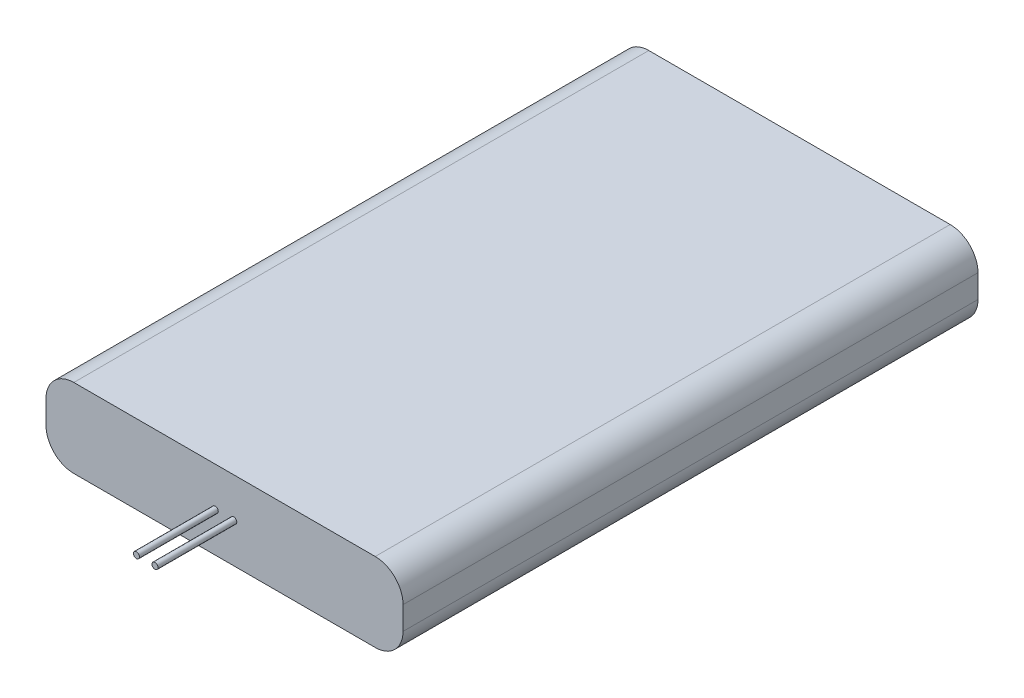
ISO-10303-21;
HEADER;
FILE_DESCRIPTION(('STEP AP214'),'2;1');
FILE_NAME('part.step','',(''),(''),'','','');
FILE_SCHEMA(('AUTOMOTIVE_DESIGN { 1 0 10303 214 1 1 1 1 }'));
ENDSEC;
DATA;
#1=APPLICATION_CONTEXT('core data for automotive mechanical design processes');
#2=APPLICATION_PROTOCOL_DEFINITION('international standard','automotive_design',2000,#1);
#3=PRODUCT_CONTEXT('',#1,'mechanical');
#4=PRODUCT('Part','Part','',(#3));
#5=PRODUCT_RELATED_PRODUCT_CATEGORY('part','',(#4));
#6=PRODUCT_DEFINITION_FORMATION('','',#4);
#7=PRODUCT_DEFINITION_CONTEXT('part definition',#1,'design');
#8=PRODUCT_DEFINITION('design','',#6,#7);
#9=PRODUCT_DEFINITION_SHAPE('','',#8);
#10=(LENGTH_UNIT() NAMED_UNIT(*) SI_UNIT(.MILLI.,.METRE.));
#11=(NAMED_UNIT(*) PLANE_ANGLE_UNIT() SI_UNIT($,.RADIAN.));
#12=(NAMED_UNIT(*) SI_UNIT($,.STERADIAN.) SOLID_ANGLE_UNIT());
#13=UNCERTAINTY_MEASURE_WITH_UNIT(LENGTH_MEASURE(1.E-05),#10,'distance_accuracy_value','');
#14=(GEOMETRIC_REPRESENTATION_CONTEXT(3) GLOBAL_UNCERTAINTY_ASSIGNED_CONTEXT((#13)) GLOBAL_UNIT_ASSIGNED_CONTEXT((#10,
#11,#12)) REPRESENTATION_CONTEXT('',''));
#15=CARTESIAN_POINT('',(0.,0.,0.));
#16=DIRECTION('',(0.,0.,1.));
#17=DIRECTION('',(1.,0.,0.));
#18=AXIS2_PLACEMENT_3D('',#15,#16,#17);
#19=CARTESIAN_POINT('',(19.25,8.5,31.));
#20=DIRECTION('',(-1.,0.,0.));
#21=DIRECTION('',(0.,0.,1.));
#22=AXIS2_PLACEMENT_3D('',#19,#20,#21);
#23=PLANE('',#22);
#24=DIRECTION('',(0.,-1.,0.));
#25=VECTOR('',#24,1.);
#26=CARTESIAN_POINT('',(19.25,8.5,31.));
#27=LINE('',#26,#25);
#28=CARTESIAN_POINT('',(19.25,5.5,31.));
#29=VERTEX_POINT('',#28);
#30=CARTESIAN_POINT('',(19.25,3.,31.));
#31=VERTEX_POINT('',#30);
#32=EDGE_CURVE('E131',#29,#31,#27,.T.);
#33=ORIENTED_EDGE('',*,*,#32,.T.);
#34=DIRECTION('',(0.,0.,-1.));
#35=VECTOR('',#34,1.);
#36=CARTESIAN_POINT('',(19.25,3.,-31.));
#37=LINE('',#36,#35);
#38=CARTESIAN_POINT('',(19.25,3.,-31.));
#39=VERTEX_POINT('',#38);
#40=EDGE_CURVE('E177',#31,#39,#37,.T.);
#41=ORIENTED_EDGE('',*,*,#40,.T.);
#42=DIRECTION('',(0.,-1.,0.));
#43=VECTOR('',#42,1.);
#44=CARTESIAN_POINT('',(19.25,8.5,-31.));
#45=LINE('',#44,#43);
#46=CARTESIAN_POINT('',(19.25,5.5,-31.));
#47=VERTEX_POINT('',#46);
#48=EDGE_CURVE('E137',#47,#39,#45,.T.);
#49=ORIENTED_EDGE('',*,*,#48,.F.);
#50=DIRECTION('',(0.,0.,-1.));
#51=VECTOR('',#50,1.);
#52=CARTESIAN_POINT('',(19.25,5.5,31.));
#53=LINE('',#52,#51);
#54=EDGE_CURVE('E174',#47,#29,#53,.F.);
#55=ORIENTED_EDGE('',*,*,#54,.T.);
#56=EDGE_LOOP('',(#33,#41,#49,#55));
#57=FACE_BOUND('',#56,.T.);
#58=ADVANCED_FACE('F39',(#57),#23,.F.);
#59=CARTESIAN_POINT('',(-19.25,8.5,-31.));
#60=DIRECTION('',(0.,0.,1.));
#61=DIRECTION('',(1.,0.,0.));
#62=AXIS2_PLACEMENT_3D('',#59,#60,#61);
#63=PLANE('',#62);
#64=DIRECTION('',(-1.,0.,0.));
#65=VECTOR('',#64,1.);
#66=CARTESIAN_POINT('',(-19.25,0.,-31.));
#67=LINE('',#66,#65);
#68=CARTESIAN_POINT('',(16.25,0.,-31.));
#69=VERTEX_POINT('',#68);
#70=CARTESIAN_POINT('',(-16.25,0.,-31.));
#71=VERTEX_POINT('',#70);
#72=EDGE_CURVE('E241',#69,#71,#67,.T.);
#73=ORIENTED_EDGE('',*,*,#72,.T.);
#74=CARTESIAN_POINT('',(-16.25,3.,-31.));
#75=DIRECTION('',(0.,0.,1.));
#76=DIRECTION('',(1.,0.,0.));
#77=AXIS2_PLACEMENT_3D('',#74,#75,#76);
#78=CIRCLE('',#77,3.);
#79=CARTESIAN_POINT('',(-19.25,3.,-31.));
#80=VERTEX_POINT('',#79);
#81=EDGE_CURVE('E164',#71,#80,#78,.F.);
#82=ORIENTED_EDGE('',*,*,#81,.T.);
#83=DIRECTION('',(0.,-1.,0.));
#84=VECTOR('',#83,1.);
#85=CARTESIAN_POINT('',(-19.25,8.5,-31.));
#86=LINE('',#85,#84);
#87=CARTESIAN_POINT('',(-19.25,5.5,-31.));
#88=VERTEX_POINT('',#87);
#89=EDGE_CURVE('E130',#88,#80,#86,.T.);
#90=ORIENTED_EDGE('',*,*,#89,.F.);
#91=CARTESIAN_POINT('',(-16.25,5.5,-31.));
#92=DIRECTION('',(0.,0.,1.));
#93=DIRECTION('',(1.,0.,0.));
#94=AXIS2_PLACEMENT_3D('',#91,#92,#93);
#95=CIRCLE('',#94,3.);
#96=CARTESIAN_POINT('',(-16.25,8.5,-31.));
#97=VERTEX_POINT('',#96);
#98=EDGE_CURVE('E135',#88,#97,#95,.F.);
#99=ORIENTED_EDGE('',*,*,#98,.T.);
#100=DIRECTION('',(-1.,0.,0.));
#101=VECTOR('',#100,1.);
#102=CARTESIAN_POINT('',(-19.25,8.5,-31.));
#103=LINE('',#102,#101);
#104=CARTESIAN_POINT('',(16.25,8.5,-31.));
#105=VERTEX_POINT('',#104);
#106=EDGE_CURVE('E230',#105,#97,#103,.T.);
#107=ORIENTED_EDGE('',*,*,#106,.F.);
#108=CARTESIAN_POINT('',(16.25,5.5,-31.));
#109=DIRECTION('',(0.,0.,1.));
#110=DIRECTION('',(1.,0.,0.));
#111=AXIS2_PLACEMENT_3D('',#108,#109,#110);
#112=CIRCLE('',#111,3.);
#113=EDGE_CURVE('E63',#105,#47,#112,.F.);
#114=ORIENTED_EDGE('',*,*,#113,.T.);
#115=ORIENTED_EDGE('',*,*,#48,.T.);
#116=CARTESIAN_POINT('',(16.25,3.,-31.));
#117=DIRECTION('',(0.,0.,1.));
#118=DIRECTION('',(1.,0.,0.));
#119=AXIS2_PLACEMENT_3D('',#116,#117,#118);
#120=CIRCLE('',#119,3.);
#121=EDGE_CURVE('E55',#39,#69,#120,.F.);
#122=ORIENTED_EDGE('',*,*,#121,.T.);
#123=EDGE_LOOP('',(#73,#82,#90,#99,#107,#114,#115,#122));
#124=FACE_BOUND('',#123,.T.);
#125=ADVANCED_FACE('F196',(#124),#63,.F.);
#126=CARTESIAN_POINT('',(-19.25,8.5,31.));
#127=DIRECTION('',(1.,0.,0.));
#128=DIRECTION('',(0.,0.,-1.));
#129=AXIS2_PLACEMENT_3D('',#126,#127,#128);
#130=PLANE('',#129);
#131=ORIENTED_EDGE('',*,*,#89,.T.);
#132=DIRECTION('',(0.,0.,1.));
#133=VECTOR('',#132,1.);
#134=CARTESIAN_POINT('',(-19.25,3.,31.));
#135=LINE('',#134,#133);
#136=CARTESIAN_POINT('',(-19.25,3.,31.));
#137=VERTEX_POINT('',#136);
#138=EDGE_CURVE('E128',#80,#137,#135,.T.);
#139=ORIENTED_EDGE('',*,*,#138,.T.);
#140=DIRECTION('',(0.,-1.,0.));
#141=VECTOR('',#140,1.);
#142=CARTESIAN_POINT('',(-19.25,8.5,31.));
#143=LINE('',#142,#141);
#144=CARTESIAN_POINT('',(-19.25,5.5,31.));
#145=VERTEX_POINT('',#144);
#146=EDGE_CURVE('E110',#145,#137,#143,.T.);
#147=ORIENTED_EDGE('',*,*,#146,.F.);
#148=DIRECTION('',(0.,0.,1.));
#149=VECTOR('',#148,1.);
#150=CARTESIAN_POINT('',(-19.25,5.5,31.));
#151=LINE('',#150,#149);
#152=EDGE_CURVE('E125',#145,#88,#151,.F.);
#153=ORIENTED_EDGE('',*,*,#152,.T.);
#154=EDGE_LOOP('',(#131,#139,#147,#153));
#155=FACE_BOUND('',#154,.T.);
#156=ADVANCED_FACE('F124',(#155),#130,.F.);
#157=CARTESIAN_POINT('',(-19.25,8.5,31.));
#158=DIRECTION('',(0.,0.,-1.));
#159=DIRECTION('',(-1.,0.,0.));
#160=AXIS2_PLACEMENT_3D('',#157,#158,#159);
#161=PLANE('',#160);
#162=CARTESIAN_POINT('',(1.,4.25,31.));
#163=DIRECTION('',(0.,0.,-1.));
#164=DIRECTION('',(-1.,0.,0.));
#165=AXIS2_PLACEMENT_3D('',#162,#163,#164);
#166=CIRCLE('',#165,0.324999999999999);
#167=CARTESIAN_POINT('',(0.675000000000001,4.25,31.));
#168=VERTEX_POINT('',#167);
#169=EDGE_CURVE('E11',#168,#168,#166,.F.);
#170=ORIENTED_EDGE('',*,*,#169,.F.);
#171=EDGE_LOOP('',(#170));
#172=FACE_BOUND('',#171,.T.);
#173=CARTESIAN_POINT('',(-0.999999999999999,4.25,31.));
#174=DIRECTION('',(0.,0.,-1.));
#175=DIRECTION('',(-1.,0.,0.));
#176=AXIS2_PLACEMENT_3D('',#173,#174,#175);
#177=CIRCLE('',#176,0.324999999999999);
#178=CARTESIAN_POINT('',(-1.325,4.25,31.));
#179=VERTEX_POINT('',#178);
#180=EDGE_CURVE('E48',#179,#179,#177,.F.);
#181=ORIENTED_EDGE('',*,*,#180,.F.);
#182=EDGE_LOOP('',(#181));
#183=FACE_BOUND('',#182,.T.);
#184=ORIENTED_EDGE('',*,*,#146,.T.);
#185=CARTESIAN_POINT('',(-16.25,3.,31.));
#186=DIRECTION('',(0.,0.,-1.));
#187=DIRECTION('',(-1.,0.,0.));
#188=AXIS2_PLACEMENT_3D('',#185,#186,#187);
#189=CIRCLE('',#188,3.);
#190=CARTESIAN_POINT('',(-16.25,0.,31.));
#191=VERTEX_POINT('',#190);
#192=EDGE_CURVE('E118',#137,#191,#189,.F.);
#193=ORIENTED_EDGE('',*,*,#192,.T.);
#194=DIRECTION('',(1.,0.,0.));
#195=VECTOR('',#194,1.);
#196=CARTESIAN_POINT('',(-19.25,0.,31.));
#197=LINE('',#196,#195);
#198=CARTESIAN_POINT('',(16.25,0.,31.));
#199=VERTEX_POINT('',#198);
#200=EDGE_CURVE('E225',#191,#199,#197,.T.);
#201=ORIENTED_EDGE('',*,*,#200,.T.);
#202=CARTESIAN_POINT('',(16.25,3.,31.));
#203=DIRECTION('',(0.,0.,-1.));
#204=DIRECTION('',(-1.,0.,0.));
#205=AXIS2_PLACEMENT_3D('',#202,#203,#204);
#206=CIRCLE('',#205,3.);
#207=EDGE_CURVE('E119',#199,#31,#206,.F.);
#208=ORIENTED_EDGE('',*,*,#207,.T.);
#209=ORIENTED_EDGE('',*,*,#32,.F.);
#210=CARTESIAN_POINT('',(16.25,5.5,31.));
#211=DIRECTION('',(0.,0.,-1.));
#212=DIRECTION('',(-1.,0.,0.));
#213=AXIS2_PLACEMENT_3D('',#210,#211,#212);
#214=CIRCLE('',#213,3.);
#215=CARTESIAN_POINT('',(16.25,8.5,31.));
#216=VERTEX_POINT('',#215);
#217=EDGE_CURVE('E141',#29,#216,#214,.F.);
#218=ORIENTED_EDGE('',*,*,#217,.T.);
#219=DIRECTION('',(1.,0.,0.));
#220=VECTOR('',#219,1.);
#221=CARTESIAN_POINT('',(-19.25,8.5,31.));
#222=LINE('',#221,#220);
#223=CARTESIAN_POINT('',(-16.25,8.5,31.));
#224=VERTEX_POINT('',#223);
#225=EDGE_CURVE('E112',#224,#216,#222,.T.);
#226=ORIENTED_EDGE('',*,*,#225,.F.);
#227=CARTESIAN_POINT('',(-16.25,5.5,31.));
#228=DIRECTION('',(0.,0.,-1.));
#229=DIRECTION('',(-1.,0.,0.));
#230=AXIS2_PLACEMENT_3D('',#227,#228,#229);
#231=CIRCLE('',#230,3.);
#232=EDGE_CURVE('E107',#224,#145,#231,.F.);
#233=ORIENTED_EDGE('',*,*,#232,.T.);
#234=EDGE_LOOP('',(#184,#193,#201,#208,#209,#218,#226,#233));
#235=FACE_BOUND('',#234,.T.);
#236=ADVANCED_FACE('F109',(#172,#183,#235),#161,.F.);
#237=CARTESIAN_POINT('',(0.,8.5,0.));
#238=DIRECTION('',(0.,-1.,0.));
#239=DIRECTION('',(0.,0.,-1.));
#240=AXIS2_PLACEMENT_3D('',#237,#238,#239);
#241=PLANE('',#240);
#242=ORIENTED_EDGE('',*,*,#106,.T.);
#243=DIRECTION('',(0.,0.,1.));
#244=VECTOR('',#243,1.);
#245=CARTESIAN_POINT('',(-16.25,8.5,0.));
#246=LINE('',#245,#244);
#247=EDGE_CURVE('E171',#97,#224,#246,.T.);
#248=ORIENTED_EDGE('',*,*,#247,.T.);
#249=ORIENTED_EDGE('',*,*,#225,.T.);
#250=DIRECTION('',(0.,0.,-1.));
#251=VECTOR('',#250,1.);
#252=CARTESIAN_POINT('',(16.25,8.5,0.));
#253=LINE('',#252,#251);
#254=EDGE_CURVE('E167',#216,#105,#253,.T.);
#255=ORIENTED_EDGE('',*,*,#254,.T.);
#256=EDGE_LOOP('',(#242,#248,#249,#255));
#257=FACE_BOUND('',#256,.T.);
#258=ADVANCED_FACE('F186',(#257),#241,.F.);
#259=CARTESIAN_POINT('',(0.,0.,0.));
#260=DIRECTION('',(0.,-1.,0.));
#261=DIRECTION('',(0.,0.,-1.));
#262=AXIS2_PLACEMENT_3D('',#259,#260,#261);
#263=PLANE('',#262);
#264=ORIENTED_EDGE('',*,*,#200,.F.);
#265=DIRECTION('',(0.,0.,1.));
#266=VECTOR('',#265,1.);
#267=CARTESIAN_POINT('',(-16.25,0.,-31.));
#268=LINE('',#267,#266);
#269=EDGE_CURVE('E155',#191,#71,#268,.F.);
#270=ORIENTED_EDGE('',*,*,#269,.T.);
#271=ORIENTED_EDGE('',*,*,#72,.F.);
#272=DIRECTION('',(0.,0.,-1.));
#273=VECTOR('',#272,1.);
#274=CARTESIAN_POINT('',(16.25,0.,31.));
#275=LINE('',#274,#273);
#276=EDGE_CURVE('E152',#69,#199,#275,.F.);
#277=ORIENTED_EDGE('',*,*,#276,.T.);
#278=EDGE_LOOP('',(#264,#270,#271,#277));
#279=FACE_BOUND('',#278,.T.);
#280=ADVANCED_FACE('F193',(#279),#263,.T.);
#281=CARTESIAN_POINT('',(-16.25,3.,31.));
#282=DIRECTION('',(0.,0.,-1.));
#283=DIRECTION('',(-1.,0.,0.));
#284=AXIS2_PLACEMENT_3D('',#281,#282,#283);
#285=CYLINDRICAL_SURFACE('',#284,3.);
#286=ORIENTED_EDGE('',*,*,#81,.F.);
#287=ORIENTED_EDGE('',*,*,#269,.F.);
#288=ORIENTED_EDGE('',*,*,#192,.F.);
#289=ORIENTED_EDGE('',*,*,#138,.F.);
#290=EDGE_LOOP('',(#286,#287,#288,#289));
#291=FACE_BOUND('',#290,.T.);
#292=ADVANCED_FACE('F209',(#291),#285,.T.);
#293=CARTESIAN_POINT('',(-16.25,5.5,0.));
#294=DIRECTION('',(0.,0.,1.));
#295=DIRECTION('',(1.,0.,0.));
#296=AXIS2_PLACEMENT_3D('',#293,#294,#295);
#297=CYLINDRICAL_SURFACE('',#296,3.);
#298=ORIENTED_EDGE('',*,*,#98,.F.);
#299=ORIENTED_EDGE('',*,*,#152,.F.);
#300=ORIENTED_EDGE('',*,*,#232,.F.);
#301=ORIENTED_EDGE('',*,*,#247,.F.);
#302=EDGE_LOOP('',(#298,#299,#300,#301));
#303=FACE_BOUND('',#302,.T.);
#304=ADVANCED_FACE('F134',(#303),#297,.T.);
#305=CARTESIAN_POINT('',(16.25,3.,31.));
#306=DIRECTION('',(0.,0.,1.));
#307=DIRECTION('',(1.,0.,0.));
#308=AXIS2_PLACEMENT_3D('',#305,#306,#307);
#309=CYLINDRICAL_SURFACE('',#308,3.);
#310=ORIENTED_EDGE('',*,*,#207,.F.);
#311=ORIENTED_EDGE('',*,*,#276,.F.);
#312=ORIENTED_EDGE('',*,*,#121,.F.);
#313=ORIENTED_EDGE('',*,*,#40,.F.);
#314=EDGE_LOOP('',(#310,#311,#312,#313));
#315=FACE_BOUND('',#314,.T.);
#316=ADVANCED_FACE('F214',(#315),#309,.T.);
#317=CARTESIAN_POINT('',(16.25,5.5,0.));
#318=DIRECTION('',(0.,0.,-1.));
#319=DIRECTION('',(-1.,0.,0.));
#320=AXIS2_PLACEMENT_3D('',#317,#318,#319);
#321=CYLINDRICAL_SURFACE('',#320,3.);
#322=ORIENTED_EDGE('',*,*,#217,.F.);
#323=ORIENTED_EDGE('',*,*,#54,.F.);
#324=ORIENTED_EDGE('',*,*,#113,.F.);
#325=ORIENTED_EDGE('',*,*,#254,.F.);
#326=EDGE_LOOP('',(#322,#323,#324,#325));
#327=FACE_BOUND('',#326,.T.);
#328=ADVANCED_FACE('F41',(#327),#321,.T.);
#329=CARTESIAN_POINT('',(-0.999999999999999,4.25,39.5));
#330=DIRECTION('',(0.,0.,-1.));
#331=DIRECTION('',(-1.,0.,0.));
#332=AXIS2_PLACEMENT_3D('',#329,#330,#331);
#333=CYLINDRICAL_SURFACE('',#332,0.324999999999999);
#334=CARTESIAN_POINT('',(-0.999999999999999,4.25,39.5));
#335=DIRECTION('',(0.,0.,1.));
#336=DIRECTION('',(1.,0.,0.));
#337=AXIS2_PLACEMENT_3D('',#334,#335,#336);
#338=CIRCLE('',#337,0.324999999999999);
#339=CARTESIAN_POINT('',(-0.675,4.25,39.5));
#340=VERTEX_POINT('',#339);
#341=EDGE_CURVE('E246',#340,#340,#338,.T.);
#342=ORIENTED_EDGE('',*,*,#341,.F.);
#343=EDGE_LOOP('',(#342));
#344=FACE_BOUND('',#343,.T.);
#345=ORIENTED_EDGE('',*,*,#180,.T.);
#346=EDGE_LOOP('',(#345));
#347=FACE_BOUND('',#346,.T.);
#348=ADVANCED_FACE('F183',(#344,#347),#333,.T.);
#349=CARTESIAN_POINT('',(-0.999999999999999,4.25,39.5));
#350=DIRECTION('',(0.,0.,1.));
#351=DIRECTION('',(1.,0.,0.));
#352=AXIS2_PLACEMENT_3D('',#349,#350,#351);
#353=PLANE('',#352);
#354=ORIENTED_EDGE('',*,*,#341,.T.);
#355=EDGE_LOOP('',(#354));
#356=FACE_BOUND('',#355,.T.);
#357=ADVANCED_FACE('F261',(#356),#353,.T.);
#358=CARTESIAN_POINT('',(1.,4.25,39.5));
#359=DIRECTION('',(0.,0.,-1.));
#360=DIRECTION('',(-1.,0.,0.));
#361=AXIS2_PLACEMENT_3D('',#358,#359,#360);
#362=CYLINDRICAL_SURFACE('',#361,0.324999999999999);
#363=CARTESIAN_POINT('',(1.,4.25,39.5));
#364=DIRECTION('',(0.,0.,1.));
#365=DIRECTION('',(1.,0.,0.));
#366=AXIS2_PLACEMENT_3D('',#363,#364,#365);
#367=CIRCLE('',#366,0.324999999999999);
#368=CARTESIAN_POINT('',(1.325,4.25,39.5));
#369=VERTEX_POINT('',#368);
#370=EDGE_CURVE('E249',#369,#369,#367,.T.);
#371=ORIENTED_EDGE('',*,*,#370,.F.);
#372=EDGE_LOOP('',(#371));
#373=FACE_BOUND('',#372,.T.);
#374=ORIENTED_EDGE('',*,*,#169,.T.);
#375=EDGE_LOOP('',(#374));
#376=FACE_BOUND('',#375,.T.);
#377=ADVANCED_FACE('F258',(#373,#376),#362,.T.);
#378=CARTESIAN_POINT('',(1.,4.25,39.5));
#379=DIRECTION('',(0.,0.,1.));
#380=DIRECTION('',(1.,0.,0.));
#381=AXIS2_PLACEMENT_3D('',#378,#379,#380);
#382=PLANE('',#381);
#383=ORIENTED_EDGE('',*,*,#370,.T.);
#384=EDGE_LOOP('',(#383));
#385=FACE_BOUND('',#384,.T.);
#386=ADVANCED_FACE('F256',(#385),#382,.T.);
#387=CLOSED_SHELL('',(#58,#125,#156,#236,#258,#280,#292,#304,#316,#328,#348,#357,#377,#386));
#388=MANIFOLD_SOLID_BREP('B2',#387);
#389=ADVANCED_BREP_SHAPE_REPRESENTATION('',(#18,#388),#14);
#390=SHAPE_DEFINITION_REPRESENTATION(#9,#389);
ENDSEC;
END-ISO-10303-21;
